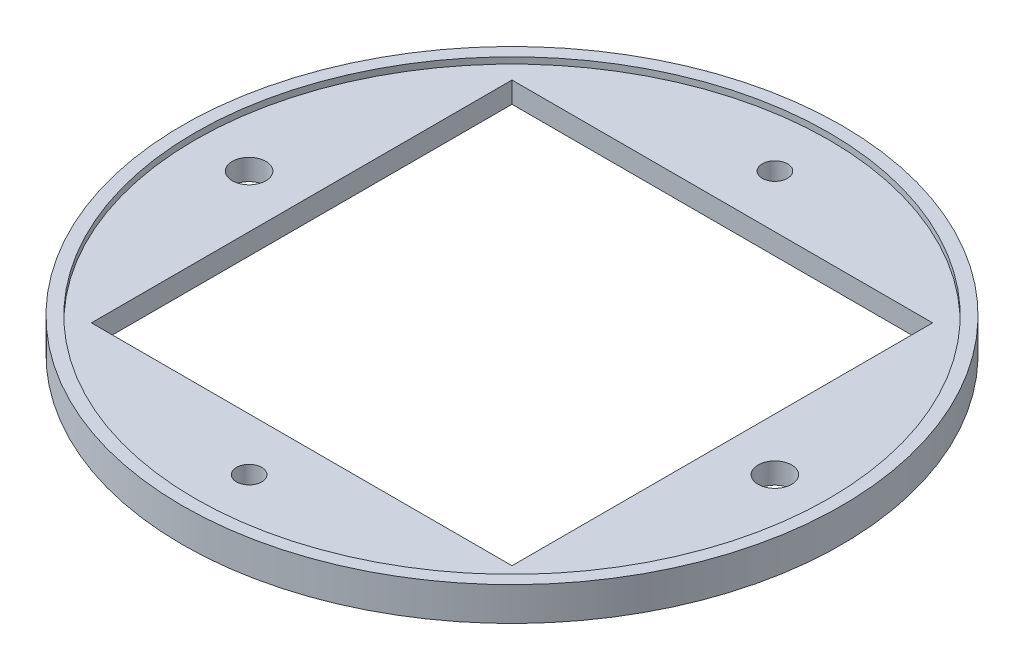
ISO-10303-21;
HEADER;
FILE_DESCRIPTION(('STEP AP214'),'2;1');
FILE_NAME('part.step','',(''),(''),'','','');
FILE_SCHEMA(('AUTOMOTIVE_DESIGN { 1 0 10303 214 1 1 1 1 }'));
ENDSEC;
DATA;
#1=APPLICATION_CONTEXT('core data for automotive mechanical design processes');
#2=APPLICATION_PROTOCOL_DEFINITION('international standard','automotive_design',2000,#1);
#3=PRODUCT_CONTEXT('',#1,'mechanical');
#4=PRODUCT('Part','Part','',(#3));
#5=PRODUCT_RELATED_PRODUCT_CATEGORY('part','',(#4));
#6=PRODUCT_DEFINITION_FORMATION('','',#4);
#7=PRODUCT_DEFINITION_CONTEXT('part definition',#1,'design');
#8=PRODUCT_DEFINITION('design','',#6,#7);
#9=PRODUCT_DEFINITION_SHAPE('','',#8);
#10=(LENGTH_UNIT() NAMED_UNIT(*) SI_UNIT(.MILLI.,.METRE.));
#11=(NAMED_UNIT(*) PLANE_ANGLE_UNIT() SI_UNIT($,.RADIAN.));
#12=(NAMED_UNIT(*) SI_UNIT($,.STERADIAN.) SOLID_ANGLE_UNIT());
#13=UNCERTAINTY_MEASURE_WITH_UNIT(LENGTH_MEASURE(1.E-05),#10,'distance_accuracy_value','');
#14=(GEOMETRIC_REPRESENTATION_CONTEXT(3) GLOBAL_UNCERTAINTY_ASSIGNED_CONTEXT((#13)) GLOBAL_UNIT_ASSIGNED_CONTEXT((#10,
#11,#12)) REPRESENTATION_CONTEXT('',''));
#15=CARTESIAN_POINT('',(0.,0.,0.));
#16=DIRECTION('',(0.,0.,1.));
#17=DIRECTION('',(1.,0.,0.));
#18=AXIS2_PLACEMENT_3D('',#15,#16,#17);
#19=CARTESIAN_POINT('',(0.,-2.5,0.));
#20=DIRECTION('',(0.,1.,0.));
#21=DIRECTION('',(0.,0.,1.));
#22=AXIS2_PLACEMENT_3D('',#19,#20,#21);
#23=PLANE('',#22);
#24=DIRECTION('',(1.,0.,0.));
#25=VECTOR('',#24,1.);
#26=CARTESIAN_POINT('',(-50.,-2.5,50.));
#27=LINE('',#26,#25);
#28=CARTESIAN_POINT('',(-50.,-2.5,50.));
#29=VERTEX_POINT('',#28);
#30=CARTESIAN_POINT('',(50.,-2.5,50.));
#31=VERTEX_POINT('',#30);
#32=EDGE_CURVE('E95',#29,#31,#27,.T.);
#33=ORIENTED_EDGE('',*,*,#32,.T.);
#34=DIRECTION('',(0.,0.,-1.));
#35=VECTOR('',#34,1.);
#36=CARTESIAN_POINT('',(50.,-2.5,50.));
#37=LINE('',#36,#35);
#38=CARTESIAN_POINT('',(50.,-2.5,-50.));
#39=VERTEX_POINT('',#38);
#40=EDGE_CURVE('E133',#31,#39,#37,.T.);
#41=ORIENTED_EDGE('',*,*,#40,.T.);
#42=DIRECTION('',(-1.,0.,0.));
#43=VECTOR('',#42,1.);
#44=CARTESIAN_POINT('',(-50.,-2.5,-50.));
#45=LINE('',#44,#43);
#46=CARTESIAN_POINT('',(-50.,-2.5,-50.));
#47=VERTEX_POINT('',#46);
#48=EDGE_CURVE('E90',#39,#47,#45,.T.);
#49=ORIENTED_EDGE('',*,*,#48,.T.);
#50=DIRECTION('',(0.,0.,1.));
#51=VECTOR('',#50,1.);
#52=CARTESIAN_POINT('',(-50.,-2.5,50.));
#53=LINE('',#52,#51);
#54=EDGE_CURVE('E57',#47,#29,#53,.T.);
#55=ORIENTED_EDGE('',*,*,#54,.T.);
#56=EDGE_LOOP('',(#33,#41,#49,#55));
#57=FACE_BOUND('',#56,.T.);
#58=CARTESIAN_POINT('',(0.,-2.5,-62.5));
#59=DIRECTION('',(0.,1.,0.));
#60=DIRECTION('',(0.,0.,1.));
#61=AXIS2_PLACEMENT_3D('',#58,#59,#60);
#62=CIRCLE('',#61,3.);
#63=CARTESIAN_POINT('',(0.,-2.5,-59.5));
#64=VERTEX_POINT('',#63);
#65=EDGE_CURVE('E129',#64,#64,#62,.T.);
#66=ORIENTED_EDGE('',*,*,#65,.T.);
#67=EDGE_LOOP('',(#66));
#68=FACE_BOUND('',#67,.T.);
#69=CARTESIAN_POINT('',(62.5,-2.5,0.));
#70=DIRECTION('',(0.,1.,0.));
#71=DIRECTION('',(0.,0.,1.));
#72=AXIS2_PLACEMENT_3D('',#69,#70,#71);
#73=CIRCLE('',#72,4.00000000000001);
#74=CARTESIAN_POINT('',(62.5,-2.5,4.00000000000001));
#75=VERTEX_POINT('',#74);
#76=EDGE_CURVE('E125',#75,#75,#73,.T.);
#77=ORIENTED_EDGE('',*,*,#76,.T.);
#78=EDGE_LOOP('',(#77));
#79=FACE_BOUND('',#78,.T.);
#80=CARTESIAN_POINT('',(0.,-2.5,62.5));
#81=DIRECTION('',(0.,1.,0.));
#82=DIRECTION('',(0.,0.,1.));
#83=AXIS2_PLACEMENT_3D('',#80,#81,#82);
#84=CIRCLE('',#83,3.);
#85=CARTESIAN_POINT('',(0.,-2.5,65.5));
#86=VERTEX_POINT('',#85);
#87=EDGE_CURVE('E121',#86,#86,#84,.T.);
#88=ORIENTED_EDGE('',*,*,#87,.T.);
#89=EDGE_LOOP('',(#88));
#90=FACE_BOUND('',#89,.T.);
#91=CARTESIAN_POINT('',(-62.5,-2.5,0.));
#92=DIRECTION('',(0.,1.,0.));
#93=DIRECTION('',(0.,0.,1.));
#94=AXIS2_PLACEMENT_3D('',#91,#92,#93);
#95=CIRCLE('',#94,4.00000000000001);
#96=CARTESIAN_POINT('',(-62.5,-2.5,4.00000000000001));
#97=VERTEX_POINT('',#96);
#98=EDGE_CURVE('E117',#97,#97,#95,.T.);
#99=ORIENTED_EDGE('',*,*,#98,.T.);
#100=EDGE_LOOP('',(#99));
#101=FACE_BOUND('',#100,.T.);
#102=CARTESIAN_POINT('',(0.,-2.5,0.));
#103=DIRECTION('',(0.,1.,0.));
#104=DIRECTION('',(0.,0.,1.));
#105=AXIS2_PLACEMENT_3D('',#102,#103,#104);
#106=CIRCLE('',#105,75.35);
#107=CARTESIAN_POINT('',(0.,-2.5,75.35));
#108=VERTEX_POINT('',#107);
#109=EDGE_CURVE('E11',#108,#108,#106,.T.);
#110=ORIENTED_EDGE('',*,*,#109,.F.);
#111=EDGE_LOOP('',(#110));
#112=FACE_BOUND('',#111,.T.);
#113=ADVANCED_FACE('F39',(#57,#68,#79,#90,#101,#112),#23,.F.);
#114=CARTESIAN_POINT('',(0.,2.5,0.));
#115=DIRECTION('',(0.,1.,0.));
#116=DIRECTION('',(0.,0.,1.));
#117=AXIS2_PLACEMENT_3D('',#114,#115,#116);
#118=PLANE('',#117);
#119=CARTESIAN_POINT('',(-62.5,2.5,0.));
#120=DIRECTION('',(0.,1.,0.));
#121=DIRECTION('',(0.,0.,1.));
#122=AXIS2_PLACEMENT_3D('',#119,#120,#121);
#123=CIRCLE('',#122,4.00000000000001);
#124=CARTESIAN_POINT('',(-62.5,2.5,4.00000000000001));
#125=VERTEX_POINT('',#124);
#126=EDGE_CURVE('E227',#125,#125,#123,.T.);
#127=ORIENTED_EDGE('',*,*,#126,.F.);
#128=EDGE_LOOP('',(#127));
#129=FACE_BOUND('',#128,.T.);
#130=CARTESIAN_POINT('',(62.5,2.5,0.));
#131=DIRECTION('',(0.,1.,0.));
#132=DIRECTION('',(0.,0.,1.));
#133=AXIS2_PLACEMENT_3D('',#130,#131,#132);
#134=CIRCLE('',#133,4.00000000000001);
#135=CARTESIAN_POINT('',(62.5,2.5,4.00000000000001));
#136=VERTEX_POINT('',#135);
#137=EDGE_CURVE('E235',#136,#136,#134,.T.);
#138=ORIENTED_EDGE('',*,*,#137,.F.);
#139=EDGE_LOOP('',(#138));
#140=FACE_BOUND('',#139,.T.);
#141=DIRECTION('',(-1.,0.,0.));
#142=VECTOR('',#141,1.);
#143=CARTESIAN_POINT('',(-50.,2.5,-50.));
#144=LINE('',#143,#142);
#145=CARTESIAN_POINT('',(50.,2.5,-50.));
#146=VERTEX_POINT('',#145);
#147=CARTESIAN_POINT('',(-50.,2.5,-50.));
#148=VERTEX_POINT('',#147);
#149=EDGE_CURVE('E87',#146,#148,#144,.T.);
#150=ORIENTED_EDGE('',*,*,#149,.F.);
#151=DIRECTION('',(0.,0.,-1.));
#152=VECTOR('',#151,1.);
#153=CARTESIAN_POINT('',(50.,2.5,50.));
#154=LINE('',#153,#152);
#155=CARTESIAN_POINT('',(50.,2.5,50.));
#156=VERTEX_POINT('',#155);
#157=EDGE_CURVE('E97',#156,#146,#154,.T.);
#158=ORIENTED_EDGE('',*,*,#157,.F.);
#159=DIRECTION('',(1.,0.,0.));
#160=VECTOR('',#159,1.);
#161=CARTESIAN_POINT('',(-50.,2.5,50.));
#162=LINE('',#161,#160);
#163=CARTESIAN_POINT('',(-50.,2.5,50.));
#164=VERTEX_POINT('',#163);
#165=EDGE_CURVE('E111',#164,#156,#162,.T.);
#166=ORIENTED_EDGE('',*,*,#165,.F.);
#167=DIRECTION('',(0.,0.,1.));
#168=VECTOR('',#167,1.);
#169=CARTESIAN_POINT('',(-50.,2.5,50.));
#170=LINE('',#169,#168);
#171=EDGE_CURVE('E107',#148,#164,#170,.T.);
#172=ORIENTED_EDGE('',*,*,#171,.F.);
#173=EDGE_LOOP('',(#150,#158,#166,#172));
#174=FACE_BOUND('',#173,.T.);
#175=CARTESIAN_POINT('',(0.,2.5,-62.5));
#176=DIRECTION('',(0.,1.,0.));
#177=DIRECTION('',(0.,0.,1.));
#178=AXIS2_PLACEMENT_3D('',#175,#176,#177);
#179=CIRCLE('',#178,3.);
#180=CARTESIAN_POINT('',(0.,2.5,-59.5));
#181=VERTEX_POINT('',#180);
#182=EDGE_CURVE('E102',#181,#181,#179,.T.);
#183=ORIENTED_EDGE('',*,*,#182,.F.);
#184=EDGE_LOOP('',(#183));
#185=FACE_BOUND('',#184,.T.);
#186=CARTESIAN_POINT('',(0.,2.5,62.5));
#187=DIRECTION('',(0.,1.,0.));
#188=DIRECTION('',(0.,0.,1.));
#189=AXIS2_PLACEMENT_3D('',#186,#187,#188);
#190=CIRCLE('',#189,3.);
#191=CARTESIAN_POINT('',(0.,2.5,65.5));
#192=VERTEX_POINT('',#191);
#193=EDGE_CURVE('E231',#192,#192,#190,.T.);
#194=ORIENTED_EDGE('',*,*,#193,.F.);
#195=EDGE_LOOP('',(#194));
#196=FACE_BOUND('',#195,.T.);
#197=CARTESIAN_POINT('',(0.,2.5,0.));
#198=DIRECTION('',(0.,1.,0.));
#199=DIRECTION('',(0.,0.,1.));
#200=AXIS2_PLACEMENT_3D('',#197,#198,#199);
#201=CIRCLE('',#200,75.35);
#202=CARTESIAN_POINT('',(0.,2.5,75.35));
#203=VERTEX_POINT('',#202);
#204=EDGE_CURVE('E43',#203,#203,#201,.T.);
#205=ORIENTED_EDGE('',*,*,#204,.T.);
#206=EDGE_LOOP('',(#205));
#207=FACE_BOUND('',#206,.T.);
#208=ADVANCED_FACE('F104',(#129,#140,#174,#185,#196,#207),#118,.T.);
#209=CARTESIAN_POINT('',(50.,-2.5,50.));
#210=DIRECTION('',(1.,0.,0.));
#211=DIRECTION('',(0.,0.,-1.));
#212=AXIS2_PLACEMENT_3D('',#209,#210,#211);
#213=PLANE('',#212);
#214=DIRECTION('',(0.,1.,0.));
#215=VECTOR('',#214,1.);
#216=CARTESIAN_POINT('',(50.,-2.5,50.));
#217=LINE('',#216,#215);
#218=EDGE_CURVE('E49',#31,#156,#217,.T.);
#219=ORIENTED_EDGE('',*,*,#218,.T.);
#220=ORIENTED_EDGE('',*,*,#157,.T.);
#221=DIRECTION('',(0.,1.,0.));
#222=VECTOR('',#221,1.);
#223=CARTESIAN_POINT('',(50.,-2.5,-50.));
#224=LINE('',#223,#222);
#225=EDGE_CURVE('E83',#39,#146,#224,.T.);
#226=ORIENTED_EDGE('',*,*,#225,.F.);
#227=ORIENTED_EDGE('',*,*,#40,.F.);
#228=EDGE_LOOP('',(#219,#220,#226,#227));
#229=FACE_BOUND('',#228,.T.);
#230=ADVANCED_FACE('F98',(#229),#213,.F.);
#231=CARTESIAN_POINT('',(-50.,-2.5,50.));
#232=DIRECTION('',(0.,0.,1.));
#233=DIRECTION('',(1.,0.,0.));
#234=AXIS2_PLACEMENT_3D('',#231,#232,#233);
#235=PLANE('',#234);
#236=DIRECTION('',(0.,1.,0.));
#237=VECTOR('',#236,1.);
#238=CARTESIAN_POINT('',(-50.,-2.5,50.));
#239=LINE('',#238,#237);
#240=EDGE_CURVE('E145',#29,#164,#239,.T.);
#241=ORIENTED_EDGE('',*,*,#240,.T.);
#242=ORIENTED_EDGE('',*,*,#165,.T.);
#243=ORIENTED_EDGE('',*,*,#218,.F.);
#244=ORIENTED_EDGE('',*,*,#32,.F.);
#245=EDGE_LOOP('',(#241,#242,#243,#244));
#246=FACE_BOUND('',#245,.T.);
#247=ADVANCED_FACE('F152',(#246),#235,.F.);
#248=CARTESIAN_POINT('',(-50.,-2.5,50.));
#249=DIRECTION('',(-1.,0.,0.));
#250=DIRECTION('',(0.,0.,1.));
#251=AXIS2_PLACEMENT_3D('',#248,#249,#250);
#252=PLANE('',#251);
#253=DIRECTION('',(0.,1.,0.));
#254=VECTOR('',#253,1.);
#255=CARTESIAN_POINT('',(-50.,-2.5,-50.));
#256=LINE('',#255,#254);
#257=EDGE_CURVE('E94',#47,#148,#256,.T.);
#258=ORIENTED_EDGE('',*,*,#257,.T.);
#259=ORIENTED_EDGE('',*,*,#171,.T.);
#260=ORIENTED_EDGE('',*,*,#240,.F.);
#261=ORIENTED_EDGE('',*,*,#54,.F.);
#262=EDGE_LOOP('',(#258,#259,#260,#261));
#263=FACE_BOUND('',#262,.T.);
#264=ADVANCED_FACE('F149',(#263),#252,.F.);
#265=CARTESIAN_POINT('',(-50.,-2.5,-50.));
#266=DIRECTION('',(0.,0.,-1.));
#267=DIRECTION('',(-1.,0.,0.));
#268=AXIS2_PLACEMENT_3D('',#265,#266,#267);
#269=PLANE('',#268);
#270=ORIENTED_EDGE('',*,*,#225,.T.);
#271=ORIENTED_EDGE('',*,*,#149,.T.);
#272=ORIENTED_EDGE('',*,*,#257,.F.);
#273=ORIENTED_EDGE('',*,*,#48,.F.);
#274=EDGE_LOOP('',(#270,#271,#272,#273));
#275=FACE_BOUND('',#274,.T.);
#276=ADVANCED_FACE('F85',(#275),#269,.F.);
#277=CARTESIAN_POINT('',(0.,-2.5,-62.5));
#278=DIRECTION('',(0.,1.,0.));
#279=DIRECTION('',(0.,0.,1.));
#280=AXIS2_PLACEMENT_3D('',#277,#278,#279);
#281=CYLINDRICAL_SURFACE('',#280,3.);
#282=ORIENTED_EDGE('',*,*,#65,.F.);
#283=EDGE_LOOP('',(#282));
#284=FACE_BOUND('',#283,.T.);
#285=ORIENTED_EDGE('',*,*,#182,.T.);
#286=EDGE_LOOP('',(#285));
#287=FACE_BOUND('',#286,.T.);
#288=ADVANCED_FACE('F170',(#284,#287),#281,.F.);
#289=CARTESIAN_POINT('',(62.5,-2.5,0.));
#290=DIRECTION('',(0.,1.,0.));
#291=DIRECTION('',(0.,0.,1.));
#292=AXIS2_PLACEMENT_3D('',#289,#290,#291);
#293=CYLINDRICAL_SURFACE('',#292,4.00000000000001);
#294=ORIENTED_EDGE('',*,*,#76,.F.);
#295=EDGE_LOOP('',(#294));
#296=FACE_BOUND('',#295,.T.);
#297=ORIENTED_EDGE('',*,*,#137,.T.);
#298=EDGE_LOOP('',(#297));
#299=FACE_BOUND('',#298,.T.);
#300=ADVANCED_FACE('F174',(#296,#299),#293,.F.);
#301=CARTESIAN_POINT('',(0.,-2.5,62.5));
#302=DIRECTION('',(0.,1.,0.));
#303=DIRECTION('',(0.,0.,1.));
#304=AXIS2_PLACEMENT_3D('',#301,#302,#303);
#305=CYLINDRICAL_SURFACE('',#304,3.);
#306=ORIENTED_EDGE('',*,*,#87,.F.);
#307=EDGE_LOOP('',(#306));
#308=FACE_BOUND('',#307,.T.);
#309=ORIENTED_EDGE('',*,*,#193,.T.);
#310=EDGE_LOOP('',(#309));
#311=FACE_BOUND('',#310,.T.);
#312=ADVANCED_FACE('F179',(#308,#311),#305,.F.);
#313=CARTESIAN_POINT('',(-62.5,-2.5,0.));
#314=DIRECTION('',(0.,1.,0.));
#315=DIRECTION('',(0.,0.,1.));
#316=AXIS2_PLACEMENT_3D('',#313,#314,#315);
#317=CYLINDRICAL_SURFACE('',#316,4.00000000000001);
#318=ORIENTED_EDGE('',*,*,#98,.F.);
#319=EDGE_LOOP('',(#318));
#320=FACE_BOUND('',#319,.T.);
#321=ORIENTED_EDGE('',*,*,#126,.T.);
#322=EDGE_LOOP('',(#321));
#323=FACE_BOUND('',#322,.T.);
#324=ADVANCED_FACE('F187',(#320,#323),#317,.F.);
#325=CARTESIAN_POINT('',(0.,4.,0.));
#326=DIRECTION('',(0.,1.,0.));
#327=DIRECTION('',(0.,0.,1.));
#328=AXIS2_PLACEMENT_3D('',#325,#326,#327);
#329=PLANE('',#328);
#330=CARTESIAN_POINT('',(0.,4.,0.));
#331=DIRECTION('',(0.,1.,0.));
#332=DIRECTION('',(0.,0.,1.));
#333=AXIS2_PLACEMENT_3D('',#330,#331,#332);
#334=CIRCLE('',#333,78.35);
#335=CARTESIAN_POINT('',(0.,4.,78.35));
#336=VERTEX_POINT('',#335);
#337=EDGE_CURVE('E209',#336,#336,#334,.T.);
#338=ORIENTED_EDGE('',*,*,#337,.T.);
#339=EDGE_LOOP('',(#338));
#340=FACE_BOUND('',#339,.T.);
#341=CARTESIAN_POINT('',(0.,4.,0.));
#342=DIRECTION('',(0.,1.,0.));
#343=DIRECTION('',(0.,0.,1.));
#344=AXIS2_PLACEMENT_3D('',#341,#342,#343);
#345=CIRCLE('',#344,75.35);
#346=CARTESIAN_POINT('',(0.,4.,75.35));
#347=VERTEX_POINT('',#346);
#348=EDGE_CURVE('E212',#347,#347,#345,.T.);
#349=ORIENTED_EDGE('',*,*,#348,.F.);
#350=EDGE_LOOP('',(#349));
#351=FACE_BOUND('',#350,.T.);
#352=ADVANCED_FACE('F190',(#340,#351),#329,.T.);
#353=CARTESIAN_POINT('',(0.,-4.,0.));
#354=DIRECTION('',(0.,1.,0.));
#355=DIRECTION('',(0.,0.,1.));
#356=AXIS2_PLACEMENT_3D('',#353,#354,#355);
#357=CYLINDRICAL_SURFACE('',#356,75.35);
#358=ORIENTED_EDGE('',*,*,#204,.F.);
#359=EDGE_LOOP('',(#358));
#360=FACE_BOUND('',#359,.T.);
#361=ORIENTED_EDGE('',*,*,#348,.T.);
#362=EDGE_LOOP('',(#361));
#363=FACE_BOUND('',#362,.T.);
#364=ADVANCED_FACE('F198',(#360,#363),#357,.F.);
#365=CARTESIAN_POINT('',(0.,-2.5,0.));
#366=DIRECTION('',(0.,1.,0.));
#367=DIRECTION('',(0.,0.,1.));
#368=AXIS2_PLACEMENT_3D('',#365,#366,#367);
#369=CYLINDRICAL_SURFACE('',#368,78.35);
#370=ORIENTED_EDGE('',*,*,#337,.F.);
#371=EDGE_LOOP('',(#370));
#372=FACE_BOUND('',#371,.T.);
#373=CARTESIAN_POINT('',(0.,-4.,0.));
#374=DIRECTION('',(0.,1.,0.));
#375=DIRECTION('',(0.,0.,1.));
#376=AXIS2_PLACEMENT_3D('',#373,#374,#375);
#377=CIRCLE('',#376,78.35);
#378=CARTESIAN_POINT('',(0.,-4.,78.35));
#379=VERTEX_POINT('',#378);
#380=EDGE_CURVE('E223',#379,#379,#377,.T.);
#381=ORIENTED_EDGE('',*,*,#380,.T.);
#382=EDGE_LOOP('',(#381));
#383=FACE_BOUND('',#382,.T.);
#384=ADVANCED_FACE('F41',(#372,#383),#369,.T.);
#385=CARTESIAN_POINT('',(0.,-4.,0.));
#386=DIRECTION('',(0.,1.,0.));
#387=DIRECTION('',(0.,0.,1.));
#388=AXIS2_PLACEMENT_3D('',#385,#386,#387);
#389=CIRCLE('',#388,75.35);
#390=CARTESIAN_POINT('',(0.,-4.,75.35));
#391=VERTEX_POINT('',#390);
#392=EDGE_CURVE('E217',#391,#391,#389,.T.);
#393=ORIENTED_EDGE('',*,*,#392,.F.);
#394=EDGE_LOOP('',(#393));
#395=FACE_BOUND('',#394,.T.);
#396=ORIENTED_EDGE('',*,*,#109,.T.);
#397=EDGE_LOOP('',(#396));
#398=FACE_BOUND('',#397,.T.);
#399=ADVANCED_FACE('F196',(#395,#398),#357,.F.);
#400=CARTESIAN_POINT('',(0.,-4.,0.));
#401=DIRECTION('',(0.,1.,0.));
#402=DIRECTION('',(0.,0.,1.));
#403=AXIS2_PLACEMENT_3D('',#400,#401,#402);
#404=PLANE('',#403);
#405=ORIENTED_EDGE('',*,*,#392,.T.);
#406=EDGE_LOOP('',(#405));
#407=FACE_BOUND('',#406,.T.);
#408=ORIENTED_EDGE('',*,*,#380,.F.);
#409=EDGE_LOOP('',(#408));
#410=FACE_BOUND('',#409,.T.);
#411=ADVANCED_FACE('F193',(#407,#410),#404,.F.);
#412=CLOSED_SHELL('',(#113,#208,#230,#247,#264,#276,#288,#300,#312,#324,#352,#364,#384,#399,#411));
#413=MANIFOLD_SOLID_BREP('B2',#412);
#414=ADVANCED_BREP_SHAPE_REPRESENTATION('',(#18,#413),#14);
#415=SHAPE_DEFINITION_REPRESENTATION(#9,#414);
ENDSEC;
END-ISO-10303-21;
